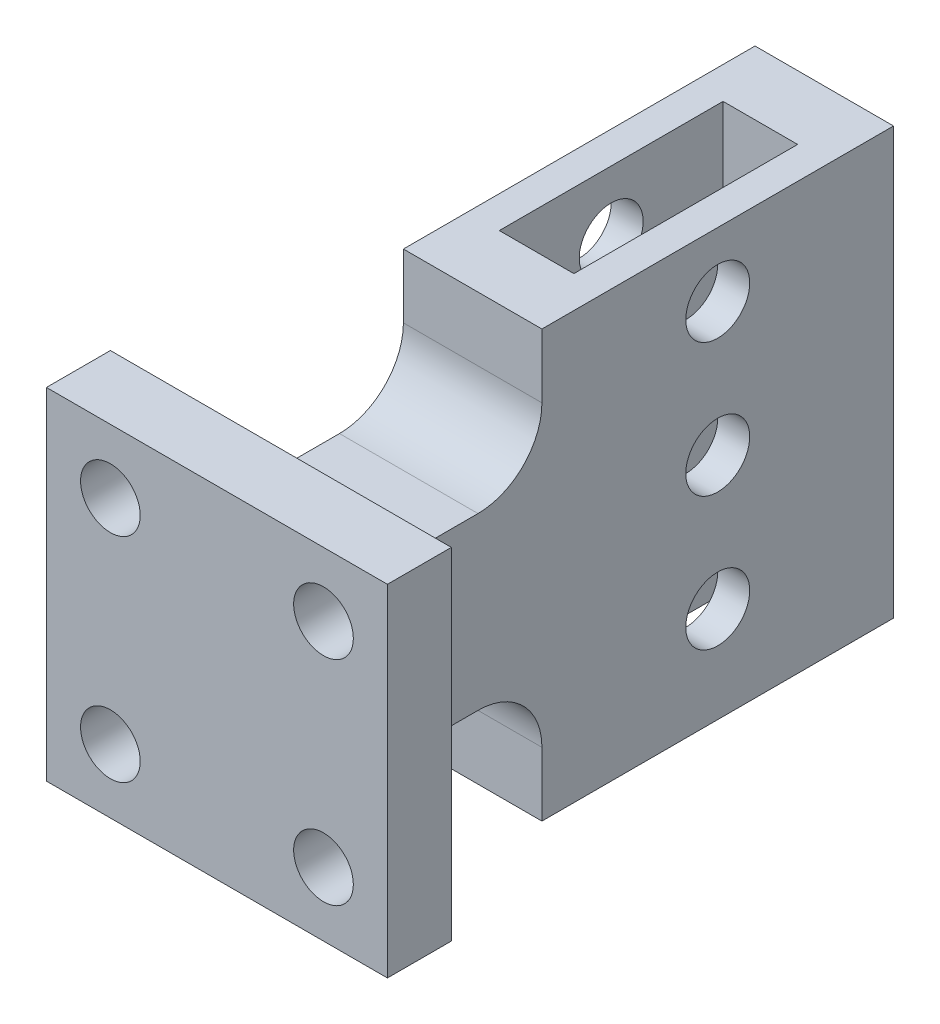
ISO-10303-21;
HEADER;
FILE_DESCRIPTION(('STEP AP214'),'2;1');
FILE_NAME('part.step','',(''),(''),'','','');
FILE_SCHEMA(('AUTOMOTIVE_DESIGN { 1 0 10303 214 1 1 1 1 }'));
ENDSEC;
DATA;
#1=APPLICATION_CONTEXT('core data for automotive mechanical design processes');
#2=APPLICATION_PROTOCOL_DEFINITION('international standard','automotive_design',2000,#1);
#3=PRODUCT_CONTEXT('',#1,'mechanical');
#4=PRODUCT('Part','Part','',(#3));
#5=PRODUCT_RELATED_PRODUCT_CATEGORY('part','',(#4));
#6=PRODUCT_DEFINITION_FORMATION('','',#4);
#7=PRODUCT_DEFINITION_CONTEXT('part definition',#1,'design');
#8=PRODUCT_DEFINITION('design','',#6,#7);
#9=PRODUCT_DEFINITION_SHAPE('','',#8);
#10=(LENGTH_UNIT() NAMED_UNIT(*) SI_UNIT(.MILLI.,.METRE.));
#11=(NAMED_UNIT(*) PLANE_ANGLE_UNIT() SI_UNIT($,.RADIAN.));
#12=(NAMED_UNIT(*) SI_UNIT($,.STERADIAN.) SOLID_ANGLE_UNIT());
#13=UNCERTAINTY_MEASURE_WITH_UNIT(LENGTH_MEASURE(1.E-05),#10,'distance_accuracy_value','');
#14=(GEOMETRIC_REPRESENTATION_CONTEXT(3) GLOBAL_UNCERTAINTY_ASSIGNED_CONTEXT((#13)) GLOBAL_UNIT_ASSIGNED_CONTEXT((#10,
#11,#12)) REPRESENTATION_CONTEXT('',''));
#15=CARTESIAN_POINT('',(0.,0.,0.));
#16=DIRECTION('',(0.,0.,1.));
#17=DIRECTION('',(1.,0.,0.));
#18=AXIS2_PLACEMENT_3D('',#15,#16,#17);
#19=CARTESIAN_POINT('',(8.,-8.,15.75));
#20=DIRECTION('',(0.,0.,-1.));
#21=DIRECTION('',(-1.,0.,0.));
#22=AXIS2_PLACEMENT_3D('',#19,#20,#21);
#23=PLANE('',#22);
#24=CARTESIAN_POINT('',(-5.,5.,15.75));
#25=DIRECTION('',(0.,0.,1.));
#26=DIRECTION('',(1.,0.,0.));
#27=AXIS2_PLACEMENT_3D('',#24,#25,#26);
#28=CIRCLE('',#27,1.4);
#29=CARTESIAN_POINT('',(-3.6,5.,15.75));
#30=VERTEX_POINT('',#29);
#31=EDGE_CURVE('E320',#30,#30,#28,.T.);
#32=ORIENTED_EDGE('',*,*,#31,.F.);
#33=EDGE_LOOP('',(#32));
#34=FACE_BOUND('',#33,.T.);
#35=CARTESIAN_POINT('',(5.,5.,15.75));
#36=DIRECTION('',(0.,0.,1.));
#37=DIRECTION('',(1.,0.,0.));
#38=AXIS2_PLACEMENT_3D('',#35,#36,#37);
#39=CIRCLE('',#38,1.4);
#40=CARTESIAN_POINT('',(6.4,5.,15.75));
#41=VERTEX_POINT('',#40);
#42=EDGE_CURVE('E316',#41,#41,#39,.F.);
#43=ORIENTED_EDGE('',*,*,#42,.T.);
#44=EDGE_LOOP('',(#43));
#45=FACE_BOUND('',#44,.T.);
#46=CARTESIAN_POINT('',(5.,-5.,15.75));
#47=DIRECTION('',(0.,0.,1.));
#48=DIRECTION('',(1.,0.,0.));
#49=AXIS2_PLACEMENT_3D('',#46,#47,#48);
#50=CIRCLE('',#49,1.4);
#51=CARTESIAN_POINT('',(6.4,-5.,15.75));
#52=VERTEX_POINT('',#51);
#53=EDGE_CURVE('E335',#52,#52,#50,.F.);
#54=ORIENTED_EDGE('',*,*,#53,.T.);
#55=EDGE_LOOP('',(#54));
#56=FACE_BOUND('',#55,.T.);
#57=DIRECTION('',(-1.,0.,0.));
#58=VECTOR('',#57,1.);
#59=CARTESIAN_POINT('',(8.,8.,15.75));
#60=LINE('',#59,#58);
#61=CARTESIAN_POINT('',(8.,8.,15.75));
#62=VERTEX_POINT('',#61);
#63=CARTESIAN_POINT('',(-8.,8.,15.75));
#64=VERTEX_POINT('',#63);
#65=EDGE_CURVE('E386',#62,#64,#60,.T.);
#66=ORIENTED_EDGE('',*,*,#65,.T.);
#67=DIRECTION('',(0.,1.,0.));
#68=VECTOR('',#67,1.);
#69=CARTESIAN_POINT('',(-8.,-8.,15.75));
#70=LINE('',#69,#68);
#71=CARTESIAN_POINT('',(-8.,-8.,15.75));
#72=VERTEX_POINT('',#71);
#73=EDGE_CURVE('E395',#72,#64,#70,.T.);
#74=ORIENTED_EDGE('',*,*,#73,.F.);
#75=DIRECTION('',(-1.,0.,0.));
#76=VECTOR('',#75,1.);
#77=CARTESIAN_POINT('',(8.,-8.,15.75));
#78=LINE('',#77,#76);
#79=CARTESIAN_POINT('',(8.,-8.,15.75));
#80=VERTEX_POINT('',#79);
#81=EDGE_CURVE('E392',#80,#72,#78,.T.);
#82=ORIENTED_EDGE('',*,*,#81,.F.);
#83=DIRECTION('',(0.,1.,0.));
#84=VECTOR('',#83,1.);
#85=CARTESIAN_POINT('',(8.,-8.,15.75));
#86=LINE('',#85,#84);
#87=EDGE_CURVE('E407',#80,#62,#86,.T.);
#88=ORIENTED_EDGE('',*,*,#87,.T.);
#89=EDGE_LOOP('',(#66,#74,#82,#88));
#90=FACE_BOUND('',#89,.T.);
#91=CARTESIAN_POINT('',(-4.99999999999999,-5.,15.75));
#92=DIRECTION('',(0.,0.,1.));
#93=DIRECTION('',(1.,0.,0.));
#94=AXIS2_PLACEMENT_3D('',#91,#92,#93);
#95=CIRCLE('',#94,1.4);
#96=CARTESIAN_POINT('',(-3.59999999999999,-5.,15.75));
#97=VERTEX_POINT('',#96);
#98=EDGE_CURVE('E325',#97,#97,#95,.T.);
#99=ORIENTED_EDGE('',*,*,#98,.F.);
#100=EDGE_LOOP('',(#99));
#101=FACE_BOUND('',#100,.T.);
#102=ADVANCED_FACE('F47',(#34,#45,#56,#90,#101),#23,.F.);
#103=CARTESIAN_POINT('',(-8.00000000000001,-8.,12.75));
#104=DIRECTION('',(0.,0.,1.));
#105=DIRECTION('',(1.,0.,0.));
#106=AXIS2_PLACEMENT_3D('',#103,#104,#105);
#107=PLANE('',#106);
#108=CARTESIAN_POINT('',(-5.,5.,12.75));
#109=DIRECTION('',(0.,0.,1.));
#110=DIRECTION('',(1.,0.,0.));
#111=AXIS2_PLACEMENT_3D('',#108,#109,#110);
#112=CIRCLE('',#111,1.4);
#113=CARTESIAN_POINT('',(-3.6,5.,12.75));
#114=VERTEX_POINT('',#113);
#115=EDGE_CURVE('E321',#114,#114,#112,.F.);
#116=ORIENTED_EDGE('',*,*,#115,.F.);
#117=EDGE_LOOP('',(#116));
#118=FACE_BOUND('',#117,.T.);
#119=CARTESIAN_POINT('',(5.,5.,12.75));
#120=DIRECTION('',(0.,0.,1.));
#121=DIRECTION('',(1.,0.,0.));
#122=AXIS2_PLACEMENT_3D('',#119,#120,#121);
#123=CIRCLE('',#122,1.4);
#124=CARTESIAN_POINT('',(6.4,5.,12.75));
#125=VERTEX_POINT('',#124);
#126=EDGE_CURVE('E311',#125,#125,#123,.T.);
#127=ORIENTED_EDGE('',*,*,#126,.T.);
#128=EDGE_LOOP('',(#127));
#129=FACE_BOUND('',#128,.T.);
#130=CARTESIAN_POINT('',(5.,-5.,12.75));
#131=DIRECTION('',(0.,0.,1.));
#132=DIRECTION('',(1.,0.,0.));
#133=AXIS2_PLACEMENT_3D('',#130,#131,#132);
#134=CIRCLE('',#133,1.4);
#135=CARTESIAN_POINT('',(6.4,-5.,12.75));
#136=VERTEX_POINT('',#135);
#137=EDGE_CURVE('E315',#136,#136,#134,.T.);
#138=ORIENTED_EDGE('',*,*,#137,.T.);
#139=EDGE_LOOP('',(#138));
#140=FACE_BOUND('',#139,.T.);
#141=DIRECTION('',(-1.,0.,0.));
#142=VECTOR('',#141,1.);
#143=CARTESIAN_POINT('',(8.00100000000001,-4.,12.75));
#144=LINE('',#143,#142);
#145=CARTESIAN_POINT('',(3.25,-4.,12.75));
#146=VERTEX_POINT('',#145);
#147=CARTESIAN_POINT('',(-3.25000000000001,-4.,12.75));
#148=VERTEX_POINT('',#147);
#149=EDGE_CURVE('E197',#146,#148,#144,.T.);
#150=ORIENTED_EDGE('',*,*,#149,.F.);
#151=DIRECTION('',(0.,1.,0.));
#152=VECTOR('',#151,1.);
#153=CARTESIAN_POINT('',(3.25,-8.,12.75));
#154=LINE('',#153,#152);
#155=CARTESIAN_POINT('',(3.25,4.,12.75));
#156=VERTEX_POINT('',#155);
#157=EDGE_CURVE('E210',#146,#156,#154,.T.);
#158=ORIENTED_EDGE('',*,*,#157,.T.);
#159=DIRECTION('',(-1.,0.,0.));
#160=VECTOR('',#159,1.);
#161=CARTESIAN_POINT('',(8.00100000000001,4.,12.75));
#162=LINE('',#161,#160);
#163=CARTESIAN_POINT('',(-3.25000000000001,4.,12.75));
#164=VERTEX_POINT('',#163);
#165=EDGE_CURVE('E367',#156,#164,#162,.T.);
#166=ORIENTED_EDGE('',*,*,#165,.T.);
#167=DIRECTION('',(0.,1.,0.));
#168=VECTOR('',#167,1.);
#169=CARTESIAN_POINT('',(-3.25000000000001,-8.,12.75));
#170=LINE('',#169,#168);
#171=EDGE_CURVE('E376',#148,#164,#170,.T.);
#172=ORIENTED_EDGE('',*,*,#171,.F.);
#173=EDGE_LOOP('',(#150,#158,#166,#172));
#174=FACE_BOUND('',#173,.T.);
#175=DIRECTION('',(0.,1.,0.));
#176=VECTOR('',#175,1.);
#177=CARTESIAN_POINT('',(8.00000000000001,-8.,12.75));
#178=LINE('',#177,#176);
#179=CARTESIAN_POINT('',(8.00000000000001,-8.,12.75));
#180=VERTEX_POINT('',#179);
#181=CARTESIAN_POINT('',(8.00000000000001,8.,12.75));
#182=VERTEX_POINT('',#181);
#183=EDGE_CURVE('E411',#180,#182,#178,.T.);
#184=ORIENTED_EDGE('',*,*,#183,.F.);
#185=DIRECTION('',(1.,0.,0.));
#186=VECTOR('',#185,1.);
#187=CARTESIAN_POINT('',(-8.00000000000001,-8.,12.75));
#188=LINE('',#187,#186);
#189=CARTESIAN_POINT('',(-8.00000000000001,-8.,12.75));
#190=VERTEX_POINT('',#189);
#191=EDGE_CURVE('E385',#190,#180,#188,.T.);
#192=ORIENTED_EDGE('',*,*,#191,.F.);
#193=DIRECTION('',(0.,1.,0.));
#194=VECTOR('',#193,1.);
#195=CARTESIAN_POINT('',(-8.00000000000001,-8.,12.75));
#196=LINE('',#195,#194);
#197=CARTESIAN_POINT('',(-8.00000000000001,8.,12.75));
#198=VERTEX_POINT('',#197);
#199=EDGE_CURVE('E380',#190,#198,#196,.T.);
#200=ORIENTED_EDGE('',*,*,#199,.T.);
#201=DIRECTION('',(1.,0.,0.));
#202=VECTOR('',#201,1.);
#203=CARTESIAN_POINT('',(0.,8.,12.75));
#204=LINE('',#203,#202);
#205=EDGE_CURVE('E204',#198,#182,#204,.T.);
#206=ORIENTED_EDGE('',*,*,#205,.T.);
#207=EDGE_LOOP('',(#184,#192,#200,#206));
#208=FACE_BOUND('',#207,.T.);
#209=CARTESIAN_POINT('',(-4.99999999999999,-5.,12.75));
#210=DIRECTION('',(0.,0.,1.));
#211=DIRECTION('',(1.,0.,0.));
#212=AXIS2_PLACEMENT_3D('',#209,#210,#211);
#213=CIRCLE('',#212,1.4);
#214=CARTESIAN_POINT('',(-3.59999999999999,-5.,12.75));
#215=VERTEX_POINT('',#214);
#216=EDGE_CURVE('E310',#215,#215,#213,.F.);
#217=ORIENTED_EDGE('',*,*,#216,.F.);
#218=EDGE_LOOP('',(#217));
#219=FACE_BOUND('',#218,.T.);
#220=ADVANCED_FACE('F472',(#118,#129,#140,#174,#208,#219),#107,.F.);
#221=CARTESIAN_POINT('',(3.25,10.,0.));
#222=DIRECTION('',(1.,0.,0.));
#223=DIRECTION('',(0.,0.,-1.));
#224=AXIS2_PLACEMENT_3D('',#221,#222,#223);
#225=PLANE('',#224);
#226=CARTESIAN_POINT('',(3.25,7.,-4.49999999999999));
#227=DIRECTION('',(1.,0.,0.));
#228=DIRECTION('',(0.,0.,-1.));
#229=AXIS2_PLACEMENT_3D('',#226,#227,#228);
#230=CIRCLE('',#229,1.5);
#231=CARTESIAN_POINT('',(3.25,7.,-5.99999999999999));
#232=VERTEX_POINT('',#231);
#233=EDGE_CURVE('E277',#232,#232,#230,.T.);
#234=ORIENTED_EDGE('',*,*,#233,.F.);
#235=EDGE_LOOP('',(#234));
#236=FACE_BOUND('',#235,.T.);
#237=CARTESIAN_POINT('',(3.25,-5.5,-4.49999999999999));
#238=DIRECTION('',(1.,0.,0.));
#239=DIRECTION('',(0.,0.,-1.));
#240=AXIS2_PLACEMENT_3D('',#237,#238,#239);
#241=CIRCLE('',#240,1.5);
#242=CARTESIAN_POINT('',(3.25,-5.5,-5.99999999999999));
#243=VERTEX_POINT('',#242);
#244=EDGE_CURVE('E769',#243,#243,#241,.T.);
#245=ORIENTED_EDGE('',*,*,#244,.F.);
#246=EDGE_LOOP('',(#245));
#247=FACE_BOUND('',#246,.T.);
#248=CARTESIAN_POINT('',(3.25,0.75,-4.49999999999999));
#249=DIRECTION('',(1.,0.,0.));
#250=DIRECTION('',(0.,0.,-1.));
#251=AXIS2_PLACEMENT_3D('',#248,#249,#250);
#252=CIRCLE('',#251,1.5);
#253=CARTESIAN_POINT('',(3.25,0.75,-5.99999999999999));
#254=VERTEX_POINT('',#253);
#255=EDGE_CURVE('E773',#254,#254,#252,.T.);
#256=ORIENTED_EDGE('',*,*,#255,.F.);
#257=EDGE_LOOP('',(#256));
#258=FACE_BOUND('',#257,.T.);
#259=DIRECTION('',(0.,0.,-1.));
#260=VECTOR('',#259,1.);
#261=CARTESIAN_POINT('',(3.25,-4.00000000000001,0.));
#262=LINE('',#261,#260);
#263=CARTESIAN_POINT('',(3.25,-4.,6.75000000000001));
#264=VERTEX_POINT('',#263);
#265=EDGE_CURVE('E196',#146,#264,#262,.T.);
#266=ORIENTED_EDGE('',*,*,#265,.T.);
#267=CARTESIAN_POINT('',(3.25,-7.,6.75000000000002));
#268=DIRECTION('',(1.,0.,0.));
#269=DIRECTION('',(0.,0.,-1.));
#270=AXIS2_PLACEMENT_3D('',#267,#268,#269);
#271=CIRCLE('',#270,3.);
#272=CARTESIAN_POINT('',(3.25,-7.,3.75000000000002));
#273=VERTEX_POINT('',#272);
#274=EDGE_CURVE('E11',#264,#273,#271,.F.);
#275=ORIENTED_EDGE('',*,*,#274,.T.);
#276=DIRECTION('',(0.,-1.,0.));
#277=VECTOR('',#276,1.);
#278=CARTESIAN_POINT('',(3.25,0.,3.75000000000001));
#279=LINE('',#278,#277);
#280=CARTESIAN_POINT('',(3.25,-10.,3.75000000000002));
#281=VERTEX_POINT('',#280);
#282=EDGE_CURVE('E174',#273,#281,#279,.T.);
#283=ORIENTED_EDGE('',*,*,#282,.T.);
#284=DIRECTION('',(0.,0.,1.));
#285=VECTOR('',#284,1.);
#286=CARTESIAN_POINT('',(3.25,-10.,0.));
#287=LINE('',#286,#285);
#288=CARTESIAN_POINT('',(3.25,-10.,-12.75));
#289=VERTEX_POINT('',#288);
#290=EDGE_CURVE('E178',#289,#281,#287,.T.);
#291=ORIENTED_EDGE('',*,*,#290,.F.);
#292=DIRECTION('',(0.,-1.,0.));
#293=VECTOR('',#292,1.);
#294=CARTESIAN_POINT('',(3.25,10.,-12.75));
#295=LINE('',#294,#293);
#296=CARTESIAN_POINT('',(3.25,10.,-12.75));
#297=VERTEX_POINT('',#296);
#298=EDGE_CURVE('E239',#297,#289,#295,.T.);
#299=ORIENTED_EDGE('',*,*,#298,.F.);
#300=DIRECTION('',(0.,0.,1.));
#301=VECTOR('',#300,1.);
#302=CARTESIAN_POINT('',(3.25,10.,0.));
#303=LINE('',#302,#301);
#304=CARTESIAN_POINT('',(3.25,10.,3.75000000000001));
#305=VERTEX_POINT('',#304);
#306=EDGE_CURVE('E234',#297,#305,#303,.T.);
#307=ORIENTED_EDGE('',*,*,#306,.T.);
#308=DIRECTION('',(0.,-1.,0.));
#309=VECTOR('',#308,1.);
#310=CARTESIAN_POINT('',(3.25,0.,3.75000000000001));
#311=LINE('',#310,#309);
#312=CARTESIAN_POINT('',(3.25,7.,3.75000000000001));
#313=VERTEX_POINT('',#312);
#314=EDGE_CURVE('E339',#305,#313,#311,.T.);
#315=ORIENTED_EDGE('',*,*,#314,.T.);
#316=CARTESIAN_POINT('',(3.25,7.,6.75000000000001));
#317=DIRECTION('',(1.,0.,0.));
#318=DIRECTION('',(0.,0.,-1.));
#319=AXIS2_PLACEMENT_3D('',#316,#317,#318);
#320=CIRCLE('',#319,3.);
#321=CARTESIAN_POINT('',(3.25,4.,6.75000000000001));
#322=VERTEX_POINT('',#321);
#323=EDGE_CURVE('E268',#313,#322,#320,.F.);
#324=ORIENTED_EDGE('',*,*,#323,.T.);
#325=DIRECTION('',(0.,0.,-1.));
#326=VECTOR('',#325,1.);
#327=CARTESIAN_POINT('',(3.25,4.,0.));
#328=LINE('',#327,#326);
#329=EDGE_CURVE('E355',#156,#322,#328,.T.);
#330=ORIENTED_EDGE('',*,*,#329,.F.);
#331=ORIENTED_EDGE('',*,*,#157,.F.);
#332=EDGE_LOOP('',(#266,#275,#283,#291,#299,#307,#315,#324,#330,#331));
#333=FACE_BOUND('',#332,.T.);
#334=ADVANCED_FACE('F176',(#236,#247,#258,#333),#225,.T.);
#335=CARTESIAN_POINT('',(-3.25,10.,0.));
#336=DIRECTION('',(1.,0.,0.));
#337=DIRECTION('',(0.,0.,-1.));
#338=AXIS2_PLACEMENT_3D('',#335,#336,#337);
#339=PLANE('',#338);
#340=CARTESIAN_POINT('',(-3.25,7.,-4.49999999999999));
#341=DIRECTION('',(1.,0.,0.));
#342=DIRECTION('',(0.,0.,-1.));
#343=AXIS2_PLACEMENT_3D('',#340,#341,#342);
#344=CIRCLE('',#343,1.5);
#345=CARTESIAN_POINT('',(-3.25,7.,-5.99999999999999));
#346=VERTEX_POINT('',#345);
#347=EDGE_CURVE('E306',#346,#346,#344,.T.);
#348=ORIENTED_EDGE('',*,*,#347,.T.);
#349=EDGE_LOOP('',(#348));
#350=FACE_BOUND('',#349,.T.);
#351=CARTESIAN_POINT('',(-3.25,-5.5,-4.49999999999999));
#352=DIRECTION('',(1.,0.,0.));
#353=DIRECTION('',(0.,0.,-1.));
#354=AXIS2_PLACEMENT_3D('',#351,#352,#353);
#355=CIRCLE('',#354,1.5);
#356=CARTESIAN_POINT('',(-3.25,-5.5,-5.99999999999999));
#357=VERTEX_POINT('',#356);
#358=EDGE_CURVE('E288',#357,#357,#355,.T.);
#359=ORIENTED_EDGE('',*,*,#358,.T.);
#360=EDGE_LOOP('',(#359));
#361=FACE_BOUND('',#360,.T.);
#362=CARTESIAN_POINT('',(-3.25,0.75,-4.49999999999999));
#363=DIRECTION('',(1.,0.,0.));
#364=DIRECTION('',(0.,0.,-1.));
#365=AXIS2_PLACEMENT_3D('',#362,#363,#364);
#366=CIRCLE('',#365,1.5);
#367=CARTESIAN_POINT('',(-3.25,0.75,-5.99999999999999));
#368=VERTEX_POINT('',#367);
#369=EDGE_CURVE('E282',#368,#368,#366,.T.);
#370=ORIENTED_EDGE('',*,*,#369,.T.);
#371=EDGE_LOOP('',(#370));
#372=FACE_BOUND('',#371,.T.);
#373=DIRECTION('',(0.,0.,1.));
#374=VECTOR('',#373,1.);
#375=CARTESIAN_POINT('',(-3.25,-10.,0.));
#376=LINE('',#375,#374);
#377=CARTESIAN_POINT('',(-3.25,-10.,-12.75));
#378=VERTEX_POINT('',#377);
#379=CARTESIAN_POINT('',(-3.25,-10.,3.75000000000001));
#380=VERTEX_POINT('',#379);
#381=EDGE_CURVE('E208',#378,#380,#376,.T.);
#382=ORIENTED_EDGE('',*,*,#381,.T.);
#383=DIRECTION('',(0.,-1.,0.));
#384=VECTOR('',#383,1.);
#385=CARTESIAN_POINT('',(-3.25,0.,3.75000000000001));
#386=LINE('',#385,#384);
#387=CARTESIAN_POINT('',(-3.25,-7.,3.75000000000001));
#388=VERTEX_POINT('',#387);
#389=EDGE_CURVE('E191',#388,#380,#386,.T.);
#390=ORIENTED_EDGE('',*,*,#389,.F.);
#391=CARTESIAN_POINT('',(-3.25,-7.,6.75000000000001));
#392=DIRECTION('',(1.,0.,0.));
#393=DIRECTION('',(0.,0.,-1.));
#394=AXIS2_PLACEMENT_3D('',#391,#392,#393);
#395=CIRCLE('',#394,3.);
#396=CARTESIAN_POINT('',(-3.25,-4.,6.75000000000001));
#397=VERTEX_POINT('',#396);
#398=EDGE_CURVE('E57',#388,#397,#395,.T.);
#399=ORIENTED_EDGE('',*,*,#398,.T.);
#400=DIRECTION('',(0.,0.,-1.));
#401=VECTOR('',#400,1.);
#402=CARTESIAN_POINT('',(-3.25,-4.00000000000001,0.));
#403=LINE('',#402,#401);
#404=EDGE_CURVE('E185',#148,#397,#403,.T.);
#405=ORIENTED_EDGE('',*,*,#404,.F.);
#406=ORIENTED_EDGE('',*,*,#171,.T.);
#407=DIRECTION('',(0.,0.,-1.));
#408=VECTOR('',#407,1.);
#409=CARTESIAN_POINT('',(-3.25,4.,0.));
#410=LINE('',#409,#408);
#411=CARTESIAN_POINT('',(-3.25,4.,6.75000000000001));
#412=VERTEX_POINT('',#411);
#413=EDGE_CURVE('E359',#164,#412,#410,.T.);
#414=ORIENTED_EDGE('',*,*,#413,.T.);
#415=CARTESIAN_POINT('',(-3.25,7.,6.75000000000001));
#416=DIRECTION('',(1.,0.,0.));
#417=DIRECTION('',(0.,0.,-1.));
#418=AXIS2_PLACEMENT_3D('',#415,#416,#417);
#419=CIRCLE('',#418,3.);
#420=CARTESIAN_POINT('',(-3.25,7.,3.75000000000001));
#421=VERTEX_POINT('',#420);
#422=EDGE_CURVE('E265',#412,#421,#419,.T.);
#423=ORIENTED_EDGE('',*,*,#422,.T.);
#424=DIRECTION('',(0.,-1.,0.));
#425=VECTOR('',#424,1.);
#426=CARTESIAN_POINT('',(-3.25,0.,3.75000000000001));
#427=LINE('',#426,#425);
#428=CARTESIAN_POINT('',(-3.25,10.,3.75000000000001));
#429=VERTEX_POINT('',#428);
#430=EDGE_CURVE('E363',#429,#421,#427,.T.);
#431=ORIENTED_EDGE('',*,*,#430,.F.);
#432=DIRECTION('',(0.,0.,1.));
#433=VECTOR('',#432,1.);
#434=CARTESIAN_POINT('',(-3.25,10.,0.));
#435=LINE('',#434,#433);
#436=CARTESIAN_POINT('',(-3.25,10.,-12.75));
#437=VERTEX_POINT('',#436);
#438=EDGE_CURVE('E425',#437,#429,#435,.T.);
#439=ORIENTED_EDGE('',*,*,#438,.F.);
#440=DIRECTION('',(0.,-1.,0.));
#441=VECTOR('',#440,1.);
#442=CARTESIAN_POINT('',(-3.25,10.,-12.75));
#443=LINE('',#442,#441);
#444=EDGE_CURVE('E249',#437,#378,#443,.T.);
#445=ORIENTED_EDGE('',*,*,#444,.T.);
#446=EDGE_LOOP('',(#382,#390,#399,#405,#406,#414,#423,#431,#439,#445));
#447=FACE_BOUND('',#446,.T.);
#448=ADVANCED_FACE('F460',(#350,#361,#372,#447),#339,.F.);
#449=CARTESIAN_POINT('',(0.,10.,-9.74999999999999));
#450=DIRECTION('',(0.,0.,-1.));
#451=DIRECTION('',(-1.,0.,0.));
#452=AXIS2_PLACEMENT_3D('',#449,#450,#451);
#453=PLANE('',#452);
#454=DIRECTION('',(0.,-1.,0.));
#455=VECTOR('',#454,1.);
#456=CARTESIAN_POINT('',(-1.75,10.,-9.74999999999999));
#457=LINE('',#456,#455);
#458=CARTESIAN_POINT('',(-1.75,10.,-9.74999999999999));
#459=VERTEX_POINT('',#458);
#460=CARTESIAN_POINT('',(-1.75,-10.,-9.74999999999999));
#461=VERTEX_POINT('',#460);
#462=EDGE_CURVE('E235',#459,#461,#457,.T.);
#463=ORIENTED_EDGE('',*,*,#462,.T.);
#464=DIRECTION('',(1.,0.,0.));
#465=VECTOR('',#464,1.);
#466=CARTESIAN_POINT('',(0.,-10.,-9.74999999999999));
#467=LINE('',#466,#465);
#468=CARTESIAN_POINT('',(1.75,-10.,-9.74999999999999));
#469=VERTEX_POINT('',#468);
#470=EDGE_CURVE('E218',#461,#469,#467,.T.);
#471=ORIENTED_EDGE('',*,*,#470,.T.);
#472=DIRECTION('',(0.,-1.,0.));
#473=VECTOR('',#472,1.);
#474=CARTESIAN_POINT('',(1.75,10.,-9.74999999999999));
#475=LINE('',#474,#473);
#476=CARTESIAN_POINT('',(1.75,10.,-9.74999999999999));
#477=VERTEX_POINT('',#476);
#478=EDGE_CURVE('E245',#477,#469,#475,.T.);
#479=ORIENTED_EDGE('',*,*,#478,.F.);
#480=DIRECTION('',(1.,0.,0.));
#481=VECTOR('',#480,1.);
#482=CARTESIAN_POINT('',(0.,10.,-9.74999999999999));
#483=LINE('',#482,#481);
#484=EDGE_CURVE('E429',#459,#477,#483,.T.);
#485=ORIENTED_EDGE('',*,*,#484,.F.);
#486=EDGE_LOOP('',(#463,#471,#479,#485));
#487=FACE_BOUND('',#486,.T.);
#488=ADVANCED_FACE('F458',(#487),#453,.F.);
#489=CARTESIAN_POINT('',(1.75,10.,0.));
#490=DIRECTION('',(1.,0.,0.));
#491=DIRECTION('',(0.,0.,-1.));
#492=AXIS2_PLACEMENT_3D('',#489,#490,#491);
#493=PLANE('',#492);
#494=CARTESIAN_POINT('',(1.75,7.,-4.49999999999999));
#495=DIRECTION('',(1.,0.,0.));
#496=DIRECTION('',(0.,0.,-1.));
#497=AXIS2_PLACEMENT_3D('',#494,#495,#496);
#498=CIRCLE('',#497,1.5);
#499=CARTESIAN_POINT('',(1.75,7.,-5.99999999999999));
#500=VERTEX_POINT('',#499);
#501=EDGE_CURVE('E302',#500,#500,#498,.T.);
#502=ORIENTED_EDGE('',*,*,#501,.T.);
#503=EDGE_LOOP('',(#502));
#504=FACE_BOUND('',#503,.T.);
#505=CARTESIAN_POINT('',(1.75,-5.5,-4.49999999999999));
#506=DIRECTION('',(1.,0.,0.));
#507=DIRECTION('',(0.,0.,-1.));
#508=AXIS2_PLACEMENT_3D('',#505,#506,#507);
#509=CIRCLE('',#508,1.5);
#510=CARTESIAN_POINT('',(1.75,-5.5,-5.99999999999999));
#511=VERTEX_POINT('',#510);
#512=EDGE_CURVE('E281',#511,#511,#509,.T.);
#513=ORIENTED_EDGE('',*,*,#512,.T.);
#514=EDGE_LOOP('',(#513));
#515=FACE_BOUND('',#514,.T.);
#516=CARTESIAN_POINT('',(1.75,0.75,-4.49999999999999));
#517=DIRECTION('',(1.,0.,0.));
#518=DIRECTION('',(0.,0.,-1.));
#519=AXIS2_PLACEMENT_3D('',#516,#517,#518);
#520=CIRCLE('',#519,1.5);
#521=CARTESIAN_POINT('',(1.75,0.75,-5.99999999999999));
#522=VERTEX_POINT('',#521);
#523=EDGE_CURVE('E276',#522,#522,#520,.T.);
#524=ORIENTED_EDGE('',*,*,#523,.T.);
#525=EDGE_LOOP('',(#524));
#526=FACE_BOUND('',#525,.T.);
#527=ORIENTED_EDGE('',*,*,#478,.T.);
#528=DIRECTION('',(0.,0.,1.));
#529=VECTOR('',#528,1.);
#530=CARTESIAN_POINT('',(1.75,-10.,0.));
#531=LINE('',#530,#529);
#532=CARTESIAN_POINT('',(1.75,-10.,0.750000000000008));
#533=VERTEX_POINT('',#532);
#534=EDGE_CURVE('E222',#469,#533,#531,.T.);
#535=ORIENTED_EDGE('',*,*,#534,.T.);
#536=DIRECTION('',(0.,-1.,0.));
#537=VECTOR('',#536,1.);
#538=CARTESIAN_POINT('',(1.75,10.,0.750000000000008));
#539=LINE('',#538,#537);
#540=CARTESIAN_POINT('',(1.75,10.,0.750000000000008));
#541=VERTEX_POINT('',#540);
#542=EDGE_CURVE('E242',#541,#533,#539,.T.);
#543=ORIENTED_EDGE('',*,*,#542,.F.);
#544=DIRECTION('',(0.,0.,1.));
#545=VECTOR('',#544,1.);
#546=CARTESIAN_POINT('',(1.75,10.,0.));
#547=LINE('',#546,#545);
#548=EDGE_CURVE('E433',#477,#541,#547,.T.);
#549=ORIENTED_EDGE('',*,*,#548,.F.);
#550=EDGE_LOOP('',(#527,#535,#543,#549));
#551=FACE_BOUND('',#550,.T.);
#552=ADVANCED_FACE('F453',(#504,#515,#526,#551),#493,.F.);
#553=CARTESIAN_POINT('',(0.,10.,0.750000000000008));
#554=DIRECTION('',(0.,0.,-1.));
#555=DIRECTION('',(-1.,0.,0.));
#556=AXIS2_PLACEMENT_3D('',#553,#554,#555);
#557=PLANE('',#556);
#558=ORIENTED_EDGE('',*,*,#542,.T.);
#559=DIRECTION('',(1.,0.,0.));
#560=VECTOR('',#559,1.);
#561=CARTESIAN_POINT('',(0.,-10.,0.750000000000008));
#562=LINE('',#561,#560);
#563=CARTESIAN_POINT('',(-1.75,-10.,0.750000000000008));
#564=VERTEX_POINT('',#563);
#565=EDGE_CURVE('E226',#564,#533,#562,.T.);
#566=ORIENTED_EDGE('',*,*,#565,.F.);
#567=DIRECTION('',(0.,-1.,0.));
#568=VECTOR('',#567,1.);
#569=CARTESIAN_POINT('',(-1.75,10.,0.750000000000008));
#570=LINE('',#569,#568);
#571=CARTESIAN_POINT('',(-1.75,10.,0.750000000000008));
#572=VERTEX_POINT('',#571);
#573=EDGE_CURVE('E238',#572,#564,#570,.T.);
#574=ORIENTED_EDGE('',*,*,#573,.F.);
#575=DIRECTION('',(1.,0.,0.));
#576=VECTOR('',#575,1.);
#577=CARTESIAN_POINT('',(0.,10.,0.750000000000008));
#578=LINE('',#577,#576);
#579=EDGE_CURVE('E435',#572,#541,#578,.T.);
#580=ORIENTED_EDGE('',*,*,#579,.T.);
#581=EDGE_LOOP('',(#558,#566,#574,#580));
#582=FACE_BOUND('',#581,.T.);
#583=ADVANCED_FACE('F455',(#582),#557,.T.);
#584=CARTESIAN_POINT('',(0.,10.,-12.75));
#585=DIRECTION('',(0.,0.,-1.));
#586=DIRECTION('',(-1.,0.,0.));
#587=AXIS2_PLACEMENT_3D('',#584,#585,#586);
#588=PLANE('',#587);
#589=ORIENTED_EDGE('',*,*,#298,.T.);
#590=DIRECTION('',(1.,0.,0.));
#591=VECTOR('',#590,1.);
#592=CARTESIAN_POINT('',(0.,-10.,-12.75));
#593=LINE('',#592,#591);
#594=EDGE_CURVE('E202',#378,#289,#593,.T.);
#595=ORIENTED_EDGE('',*,*,#594,.F.);
#596=ORIENTED_EDGE('',*,*,#444,.F.);
#597=DIRECTION('',(1.,0.,0.));
#598=VECTOR('',#597,1.);
#599=CARTESIAN_POINT('',(0.,10.,-12.75));
#600=LINE('',#599,#598);
#601=EDGE_CURVE('E421',#437,#297,#600,.T.);
#602=ORIENTED_EDGE('',*,*,#601,.T.);
#603=EDGE_LOOP('',(#589,#595,#596,#602));
#604=FACE_BOUND('',#603,.T.);
#605=ADVANCED_FACE('F504',(#604),#588,.T.);
#606=CARTESIAN_POINT('',(-1.75,10.,0.));
#607=DIRECTION('',(1.,0.,0.));
#608=DIRECTION('',(0.,0.,-1.));
#609=AXIS2_PLACEMENT_3D('',#606,#607,#608);
#610=PLANE('',#609);
#611=CARTESIAN_POINT('',(-1.75,7.,-4.49999999999999));
#612=DIRECTION('',(1.,0.,0.));
#613=DIRECTION('',(0.,0.,-1.));
#614=AXIS2_PLACEMENT_3D('',#611,#612,#613);
#615=CIRCLE('',#614,1.5);
#616=CARTESIAN_POINT('',(-1.75,7.,-5.99999999999999));
#617=VERTEX_POINT('',#616);
#618=EDGE_CURVE('E51',#617,#617,#615,.T.);
#619=ORIENTED_EDGE('',*,*,#618,.F.);
#620=EDGE_LOOP('',(#619));
#621=FACE_BOUND('',#620,.T.);
#622=CARTESIAN_POINT('',(-1.75,-5.5,-4.49999999999999));
#623=DIRECTION('',(1.,0.,0.));
#624=DIRECTION('',(0.,0.,-1.));
#625=AXIS2_PLACEMENT_3D('',#622,#623,#624);
#626=CIRCLE('',#625,1.5);
#627=CARTESIAN_POINT('',(-1.75,-5.5,-5.99999999999999));
#628=VERTEX_POINT('',#627);
#629=EDGE_CURVE('E278',#628,#628,#626,.T.);
#630=ORIENTED_EDGE('',*,*,#629,.F.);
#631=EDGE_LOOP('',(#630));
#632=FACE_BOUND('',#631,.T.);
#633=CARTESIAN_POINT('',(-1.75,0.75,-4.49999999999999));
#634=DIRECTION('',(1.,0.,0.));
#635=DIRECTION('',(0.,0.,-1.));
#636=AXIS2_PLACEMENT_3D('',#633,#634,#635);
#637=CIRCLE('',#636,1.5);
#638=CARTESIAN_POINT('',(-1.75,0.75,-5.99999999999999));
#639=VERTEX_POINT('',#638);
#640=EDGE_CURVE('E273',#639,#639,#637,.T.);
#641=ORIENTED_EDGE('',*,*,#640,.F.);
#642=EDGE_LOOP('',(#641));
#643=FACE_BOUND('',#642,.T.);
#644=ORIENTED_EDGE('',*,*,#573,.T.);
#645=DIRECTION('',(0.,0.,1.));
#646=VECTOR('',#645,1.);
#647=CARTESIAN_POINT('',(-1.75,-10.,0.));
#648=LINE('',#647,#646);
#649=EDGE_CURVE('E230',#461,#564,#648,.T.);
#650=ORIENTED_EDGE('',*,*,#649,.F.);
#651=ORIENTED_EDGE('',*,*,#462,.F.);
#652=DIRECTION('',(0.,0.,1.));
#653=VECTOR('',#652,1.);
#654=CARTESIAN_POINT('',(-1.75,10.,0.));
#655=LINE('',#654,#653);
#656=EDGE_CURVE('E213',#459,#572,#655,.T.);
#657=ORIENTED_EDGE('',*,*,#656,.T.);
#658=EDGE_LOOP('',(#644,#650,#651,#657));
#659=FACE_BOUND('',#658,.T.);
#660=ADVANCED_FACE('F444',(#621,#632,#643,#659),#610,.T.);
#661=CARTESIAN_POINT('',(0.,10.,0.));
#662=DIRECTION('',(0.,1.,0.));
#663=DIRECTION('',(0.,0.,1.));
#664=AXIS2_PLACEMENT_3D('',#661,#662,#663);
#665=PLANE('',#664);
#666=DIRECTION('',(-1.,0.,0.));
#667=VECTOR('',#666,1.);
#668=CARTESIAN_POINT('',(8.00100000000001,10.,3.75000000000001));
#669=LINE('',#668,#667);
#670=EDGE_CURVE('E186',#305,#429,#669,.T.);
#671=ORIENTED_EDGE('',*,*,#670,.F.);
#672=ORIENTED_EDGE('',*,*,#306,.F.);
#673=ORIENTED_EDGE('',*,*,#601,.F.);
#674=ORIENTED_EDGE('',*,*,#438,.T.);
#675=EDGE_LOOP('',(#671,#672,#673,#674));
#676=FACE_BOUND('',#675,.T.);
#677=ORIENTED_EDGE('',*,*,#484,.T.);
#678=ORIENTED_EDGE('',*,*,#548,.T.);
#679=ORIENTED_EDGE('',*,*,#579,.F.);
#680=ORIENTED_EDGE('',*,*,#656,.F.);
#681=EDGE_LOOP('',(#677,#678,#679,#680));
#682=FACE_BOUND('',#681,.T.);
#683=ADVANCED_FACE('F449',(#676,#682),#665,.T.);
#684=CARTESIAN_POINT('',(0.,-10.,0.));
#685=DIRECTION('',(0.,1.,0.));
#686=DIRECTION('',(0.,0.,1.));
#687=AXIS2_PLACEMENT_3D('',#684,#685,#686);
#688=PLANE('',#687);
#689=ORIENTED_EDGE('',*,*,#290,.T.);
#690=DIRECTION('',(-1.,0.,0.));
#691=VECTOR('',#690,1.);
#692=CARTESIAN_POINT('',(8.00100000000001,-10.,3.75000000000002));
#693=LINE('',#692,#691);
#694=EDGE_CURVE('E189',#281,#380,#693,.T.);
#695=ORIENTED_EDGE('',*,*,#694,.T.);
#696=ORIENTED_EDGE('',*,*,#381,.F.);
#697=ORIENTED_EDGE('',*,*,#594,.T.);
#698=EDGE_LOOP('',(#689,#695,#696,#697));
#699=FACE_BOUND('',#698,.T.);
#700=ORIENTED_EDGE('',*,*,#470,.F.);
#701=ORIENTED_EDGE('',*,*,#649,.T.);
#702=ORIENTED_EDGE('',*,*,#565,.T.);
#703=ORIENTED_EDGE('',*,*,#534,.F.);
#704=EDGE_LOOP('',(#700,#701,#702,#703));
#705=FACE_BOUND('',#704,.T.);
#706=ADVANCED_FACE('F199',(#699,#705),#688,.F.);
#707=CARTESIAN_POINT('',(0.,-8.,0.));
#708=DIRECTION('',(0.,1.,0.));
#709=DIRECTION('',(0.,0.,1.));
#710=AXIS2_PLACEMENT_3D('',#707,#708,#709);
#711=PLANE('',#710);
#712=ORIENTED_EDGE('',*,*,#191,.T.);
#713=DIRECTION('',(0.,0.,1.));
#714=VECTOR('',#713,1.);
#715=CARTESIAN_POINT('',(8.00000000000001,-8.,12.75));
#716=LINE('',#715,#714);
#717=EDGE_CURVE('E389',#180,#80,#716,.T.);
#718=ORIENTED_EDGE('',*,*,#717,.T.);
#719=ORIENTED_EDGE('',*,*,#81,.T.);
#720=DIRECTION('',(0.,0.,-1.));
#721=VECTOR('',#720,1.);
#722=CARTESIAN_POINT('',(-8.,-8.,15.75));
#723=LINE('',#722,#721);
#724=EDGE_CURVE('E381',#72,#190,#723,.T.);
#725=ORIENTED_EDGE('',*,*,#724,.T.);
#726=EDGE_LOOP('',(#712,#718,#719,#725));
#727=FACE_BOUND('',#726,.T.);
#728=ADVANCED_FACE('F501',(#727),#711,.F.);
#729=CARTESIAN_POINT('',(0.,8.,0.));
#730=DIRECTION('',(0.,1.,0.));
#731=DIRECTION('',(0.,0.,1.));
#732=AXIS2_PLACEMENT_3D('',#729,#730,#731);
#733=PLANE('',#732);
#734=ORIENTED_EDGE('',*,*,#205,.F.);
#735=DIRECTION('',(0.,0.,-1.));
#736=VECTOR('',#735,1.);
#737=CARTESIAN_POINT('',(-8.,8.,15.75));
#738=LINE('',#737,#736);
#739=EDGE_CURVE('E351',#64,#198,#738,.T.);
#740=ORIENTED_EDGE('',*,*,#739,.F.);
#741=ORIENTED_EDGE('',*,*,#65,.F.);
#742=DIRECTION('',(0.,0.,1.));
#743=VECTOR('',#742,1.);
#744=CARTESIAN_POINT('',(8.00000000000001,8.,12.75));
#745=LINE('',#744,#743);
#746=EDGE_CURVE('E399',#182,#62,#745,.T.);
#747=ORIENTED_EDGE('',*,*,#746,.F.);
#748=EDGE_LOOP('',(#734,#740,#741,#747));
#749=FACE_BOUND('',#748,.T.);
#750=ADVANCED_FACE('F485',(#749),#733,.T.);
#751=CARTESIAN_POINT('',(-8.,-8.,15.75));
#752=DIRECTION('',(1.,0.,0.));
#753=DIRECTION('',(0.,0.,-1.));
#754=AXIS2_PLACEMENT_3D('',#751,#752,#753);
#755=PLANE('',#754);
#756=ORIENTED_EDGE('',*,*,#739,.T.);
#757=ORIENTED_EDGE('',*,*,#199,.F.);
#758=ORIENTED_EDGE('',*,*,#724,.F.);
#759=ORIENTED_EDGE('',*,*,#73,.T.);
#760=EDGE_LOOP('',(#756,#757,#758,#759));
#761=FACE_BOUND('',#760,.T.);
#762=ADVANCED_FACE('F490',(#761),#755,.F.);
#763=CARTESIAN_POINT('',(8.00000000000001,-8.,12.75));
#764=DIRECTION('',(-1.,0.,0.));
#765=DIRECTION('',(0.,0.,1.));
#766=AXIS2_PLACEMENT_3D('',#763,#764,#765);
#767=PLANE('',#766);
#768=ORIENTED_EDGE('',*,*,#746,.T.);
#769=ORIENTED_EDGE('',*,*,#87,.F.);
#770=ORIENTED_EDGE('',*,*,#717,.F.);
#771=ORIENTED_EDGE('',*,*,#183,.T.);
#772=EDGE_LOOP('',(#768,#769,#770,#771));
#773=FACE_BOUND('',#772,.T.);
#774=ADVANCED_FACE('F487',(#773),#767,.F.);
#775=CARTESIAN_POINT('',(8.00100000000001,4.,0.));
#776=DIRECTION('',(0.,1.,0.));
#777=DIRECTION('',(0.,0.,1.));
#778=AXIS2_PLACEMENT_3D('',#775,#776,#777);
#779=PLANE('',#778);
#780=ORIENTED_EDGE('',*,*,#329,.T.);
#781=DIRECTION('',(-1.,0.,0.));
#782=VECTOR('',#781,1.);
#783=CARTESIAN_POINT('',(8.00100000000001,4.,6.75000000000001));
#784=LINE('',#783,#782);
#785=EDGE_CURVE('E248',#322,#412,#784,.T.);
#786=ORIENTED_EDGE('',*,*,#785,.T.);
#787=ORIENTED_EDGE('',*,*,#413,.F.);
#788=ORIENTED_EDGE('',*,*,#165,.F.);
#789=EDGE_LOOP('',(#780,#786,#787,#788));
#790=FACE_BOUND('',#789,.T.);
#791=ADVANCED_FACE('F489',(#790),#779,.T.);
#792=CARTESIAN_POINT('',(8.00100000000001,0.,3.75000000000001));
#793=DIRECTION('',(0.,0.,-1.));
#794=DIRECTION('',(0.,1.,0.));
#795=AXIS2_PLACEMENT_3D('',#792,#793,#794);
#796=PLANE('',#795);
#797=ORIENTED_EDGE('',*,*,#430,.T.);
#798=DIRECTION('',(-1.,0.,0.));
#799=VECTOR('',#798,1.);
#800=CARTESIAN_POINT('',(8.00100000000001,7.,3.75000000000001));
#801=LINE('',#800,#799);
#802=EDGE_CURVE('E257',#421,#313,#801,.F.);
#803=ORIENTED_EDGE('',*,*,#802,.T.);
#804=ORIENTED_EDGE('',*,*,#314,.F.);
#805=ORIENTED_EDGE('',*,*,#670,.T.);
#806=EDGE_LOOP('',(#797,#803,#804,#805));
#807=FACE_BOUND('',#806,.T.);
#808=ADVANCED_FACE('F547',(#807),#796,.F.);
#809=CARTESIAN_POINT('',(8.00100000000001,0.,3.75000000000001));
#810=DIRECTION('',(0.,0.,-1.));
#811=DIRECTION('',(0.,1.,0.));
#812=AXIS2_PLACEMENT_3D('',#809,#810,#811);
#813=PLANE('',#812);
#814=ORIENTED_EDGE('',*,*,#282,.F.);
#815=DIRECTION('',(-1.,0.,0.));
#816=VECTOR('',#815,1.);
#817=CARTESIAN_POINT('',(-3.25,-7.,3.75000000000001));
#818=LINE('',#817,#816);
#819=EDGE_CURVE('E260',#273,#388,#818,.T.);
#820=ORIENTED_EDGE('',*,*,#819,.T.);
#821=ORIENTED_EDGE('',*,*,#389,.T.);
#822=ORIENTED_EDGE('',*,*,#694,.F.);
#823=EDGE_LOOP('',(#814,#820,#821,#822));
#824=FACE_BOUND('',#823,.T.);
#825=ADVANCED_FACE('F190',(#824),#813,.F.);
#826=CARTESIAN_POINT('',(8.00100000000001,-4.00000000000001,0.));
#827=DIRECTION('',(0.,1.,0.));
#828=DIRECTION('',(0.,0.,1.));
#829=AXIS2_PLACEMENT_3D('',#826,#827,#828);
#830=PLANE('',#829);
#831=ORIENTED_EDGE('',*,*,#404,.T.);
#832=DIRECTION('',(-1.,0.,0.));
#833=VECTOR('',#832,1.);
#834=CARTESIAN_POINT('',(3.25,-4.,6.75000000000001));
#835=LINE('',#834,#833);
#836=EDGE_CURVE('E65',#397,#264,#835,.F.);
#837=ORIENTED_EDGE('',*,*,#836,.T.);
#838=ORIENTED_EDGE('',*,*,#265,.F.);
#839=ORIENTED_EDGE('',*,*,#149,.T.);
#840=EDGE_LOOP('',(#831,#837,#838,#839));
#841=FACE_BOUND('',#840,.T.);
#842=ADVANCED_FACE('F540',(#841),#830,.F.);
#843=CARTESIAN_POINT('',(5.,-5.,-12.751));
#844=DIRECTION('',(0.,0.,1.));
#845=DIRECTION('',(1.,0.,0.));
#846=AXIS2_PLACEMENT_3D('',#843,#844,#845);
#847=CYLINDRICAL_SURFACE('',#846,1.4);
#848=ORIENTED_EDGE('',*,*,#53,.F.);
#849=EDGE_LOOP('',(#848));
#850=FACE_BOUND('',#849,.T.);
#851=ORIENTED_EDGE('',*,*,#137,.F.);
#852=EDGE_LOOP('',(#851));
#853=FACE_BOUND('',#852,.T.);
#854=ADVANCED_FACE('F629',(#850,#853),#847,.F.);
#855=CARTESIAN_POINT('',(5.,5.,-12.751));
#856=DIRECTION('',(0.,0.,1.));
#857=DIRECTION('',(1.,0.,0.));
#858=AXIS2_PLACEMENT_3D('',#855,#856,#857);
#859=CYLINDRICAL_SURFACE('',#858,1.4);
#860=ORIENTED_EDGE('',*,*,#42,.F.);
#861=EDGE_LOOP('',(#860));
#862=FACE_BOUND('',#861,.T.);
#863=ORIENTED_EDGE('',*,*,#126,.F.);
#864=EDGE_LOOP('',(#863));
#865=FACE_BOUND('',#864,.T.);
#866=ADVANCED_FACE('F665',(#862,#865),#859,.F.);
#867=CARTESIAN_POINT('',(-5.,5.,-12.751));
#868=DIRECTION('',(0.,0.,1.));
#869=DIRECTION('',(1.,0.,0.));
#870=AXIS2_PLACEMENT_3D('',#867,#868,#869);
#871=CYLINDRICAL_SURFACE('',#870,1.4);
#872=ORIENTED_EDGE('',*,*,#31,.T.);
#873=EDGE_LOOP('',(#872));
#874=FACE_BOUND('',#873,.T.);
#875=ORIENTED_EDGE('',*,*,#115,.T.);
#876=EDGE_LOOP('',(#875));
#877=FACE_BOUND('',#876,.T.);
#878=ADVANCED_FACE('F527',(#874,#877),#871,.F.);
#879=CARTESIAN_POINT('',(-4.99999999999999,-5.,-12.751));
#880=DIRECTION('',(0.,0.,1.));
#881=DIRECTION('',(1.,0.,0.));
#882=AXIS2_PLACEMENT_3D('',#879,#880,#881);
#883=CYLINDRICAL_SURFACE('',#882,1.4);
#884=ORIENTED_EDGE('',*,*,#98,.T.);
#885=EDGE_LOOP('',(#884));
#886=FACE_BOUND('',#885,.T.);
#887=ORIENTED_EDGE('',*,*,#216,.T.);
#888=EDGE_LOOP('',(#887));
#889=FACE_BOUND('',#888,.T.);
#890=ADVANCED_FACE('F518',(#886,#889),#883,.F.);
#891=CARTESIAN_POINT('',(8.00100000000001,7.,6.75000000000001));
#892=DIRECTION('',(-1.,0.,0.));
#893=DIRECTION('',(0.,0.,1.));
#894=AXIS2_PLACEMENT_3D('',#891,#892,#893);
#895=CYLINDRICAL_SURFACE('',#894,3.);
#896=ORIENTED_EDGE('',*,*,#323,.F.);
#897=ORIENTED_EDGE('',*,*,#802,.F.);
#898=ORIENTED_EDGE('',*,*,#422,.F.);
#899=ORIENTED_EDGE('',*,*,#785,.F.);
#900=EDGE_LOOP('',(#896,#897,#898,#899));
#901=FACE_BOUND('',#900,.T.);
#902=ADVANCED_FACE('F516',(#901),#895,.F.);
#903=CARTESIAN_POINT('',(8.00100000000001,-7.,6.75000000000002));
#904=DIRECTION('',(1.,0.,0.));
#905=DIRECTION('',(0.,0.,-1.));
#906=AXIS2_PLACEMENT_3D('',#903,#904,#905);
#907=CYLINDRICAL_SURFACE('',#906,3.);
#908=ORIENTED_EDGE('',*,*,#274,.F.);
#909=ORIENTED_EDGE('',*,*,#836,.F.);
#910=ORIENTED_EDGE('',*,*,#398,.F.);
#911=ORIENTED_EDGE('',*,*,#819,.F.);
#912=EDGE_LOOP('',(#908,#909,#910,#911));
#913=FACE_BOUND('',#912,.T.);
#914=ADVANCED_FACE('F49',(#913),#907,.F.);
#915=CARTESIAN_POINT('',(-8.00000000000001,0.75,-4.49999999999999));
#916=DIRECTION('',(1.,0.,0.));
#917=DIRECTION('',(0.,0.,-1.));
#918=AXIS2_PLACEMENT_3D('',#915,#916,#917);
#919=CYLINDRICAL_SURFACE('',#918,1.5);
#920=ORIENTED_EDGE('',*,*,#640,.T.);
#921=EDGE_LOOP('',(#920));
#922=FACE_BOUND('',#921,.T.);
#923=ORIENTED_EDGE('',*,*,#369,.F.);
#924=EDGE_LOOP('',(#923));
#925=FACE_BOUND('',#924,.T.);
#926=ADVANCED_FACE('F524',(#922,#925),#919,.F.);
#927=CARTESIAN_POINT('',(-8.00000000000001,-5.5,-4.49999999999999));
#928=DIRECTION('',(1.,0.,0.));
#929=DIRECTION('',(0.,0.,-1.));
#930=AXIS2_PLACEMENT_3D('',#927,#928,#929);
#931=CYLINDRICAL_SURFACE('',#930,1.5);
#932=ORIENTED_EDGE('',*,*,#629,.T.);
#933=EDGE_LOOP('',(#932));
#934=FACE_BOUND('',#933,.T.);
#935=ORIENTED_EDGE('',*,*,#358,.F.);
#936=EDGE_LOOP('',(#935));
#937=FACE_BOUND('',#936,.T.);
#938=ADVANCED_FACE('F709',(#934,#937),#931,.F.);
#939=CARTESIAN_POINT('',(-8.00000000000001,7.,-4.49999999999999));
#940=DIRECTION('',(1.,0.,0.));
#941=DIRECTION('',(0.,0.,-1.));
#942=AXIS2_PLACEMENT_3D('',#939,#940,#941);
#943=CYLINDRICAL_SURFACE('',#942,1.5);
#944=ORIENTED_EDGE('',*,*,#618,.T.);
#945=EDGE_LOOP('',(#944));
#946=FACE_BOUND('',#945,.T.);
#947=ORIENTED_EDGE('',*,*,#347,.F.);
#948=EDGE_LOOP('',(#947));
#949=FACE_BOUND('',#948,.T.);
#950=ADVANCED_FACE('F720',(#946,#949),#943,.F.);
#951=ORIENTED_EDGE('',*,*,#255,.T.);
#952=EDGE_LOOP('',(#951));
#953=FACE_BOUND('',#952,.T.);
#954=ORIENTED_EDGE('',*,*,#523,.F.);
#955=EDGE_LOOP('',(#954));
#956=FACE_BOUND('',#955,.T.);
#957=ADVANCED_FACE('F712',(#953,#956),#919,.F.);
#958=ORIENTED_EDGE('',*,*,#244,.T.);
#959=EDGE_LOOP('',(#958));
#960=FACE_BOUND('',#959,.T.);
#961=ORIENTED_EDGE('',*,*,#512,.F.);
#962=EDGE_LOOP('',(#961));
#963=FACE_BOUND('',#962,.T.);
#964=ADVANCED_FACE('F722',(#960,#963),#931,.F.);
#965=ORIENTED_EDGE('',*,*,#233,.T.);
#966=EDGE_LOOP('',(#965));
#967=FACE_BOUND('',#966,.T.);
#968=ORIENTED_EDGE('',*,*,#501,.F.);
#969=EDGE_LOOP('',(#968));
#970=FACE_BOUND('',#969,.T.);
#971=ADVANCED_FACE('F732',(#967,#970),#943,.F.);
#972=CLOSED_SHELL('',(#102,#220,#334,#448,#488,#552,#583,#605,#660,#683,#706,#728,#750,#762,
#774,#791,#808,#825,#842,#854,#866,#878,#890,#902,#914,#926,#938,#950,#957,#964,#971));
#973=MANIFOLD_SOLID_BREP('B2',#972);
#974=ADVANCED_BREP_SHAPE_REPRESENTATION('',(#18,#973),#14);
#975=SHAPE_DEFINITION_REPRESENTATION(#9,#974);
ENDSEC;
END-ISO-10303-21;
